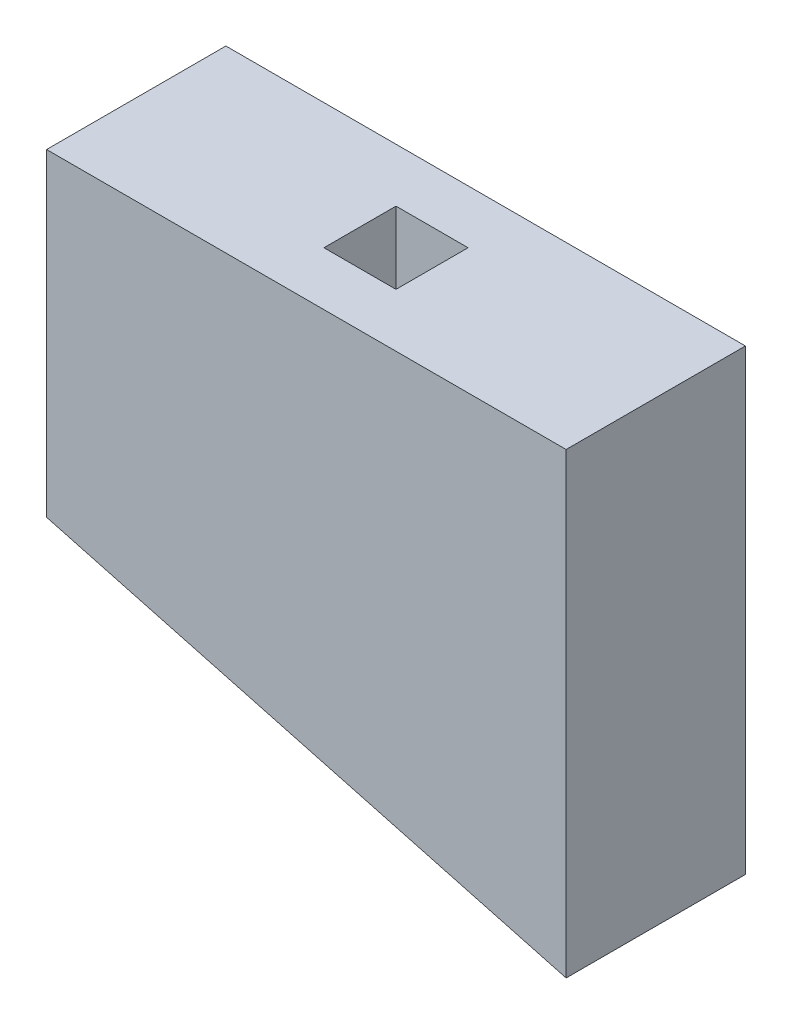
ISO-10303-21;
HEADER;
FILE_DESCRIPTION(('STEP AP214'),'2;1');
FILE_NAME('part.step','',(''),(''),'','','');
FILE_SCHEMA(('AUTOMOTIVE_DESIGN { 1 0 10303 214 1 1 1 1 }'));
ENDSEC;
DATA;
#1=APPLICATION_CONTEXT('core data for automotive mechanical design processes');
#2=APPLICATION_PROTOCOL_DEFINITION('international standard','automotive_design',2000,#1);
#3=PRODUCT_CONTEXT('',#1,'mechanical');
#4=PRODUCT('Part','Part','',(#3));
#5=PRODUCT_RELATED_PRODUCT_CATEGORY('part','',(#4));
#6=PRODUCT_DEFINITION_FORMATION('','',#4);
#7=PRODUCT_DEFINITION_CONTEXT('part definition',#1,'design');
#8=PRODUCT_DEFINITION('design','',#6,#7);
#9=PRODUCT_DEFINITION_SHAPE('','',#8);
#10=(LENGTH_UNIT() NAMED_UNIT(*) SI_UNIT(.MILLI.,.METRE.));
#11=(NAMED_UNIT(*) PLANE_ANGLE_UNIT() SI_UNIT($,.RADIAN.));
#12=(NAMED_UNIT(*) SI_UNIT($,.STERADIAN.) SOLID_ANGLE_UNIT());
#13=UNCERTAINTY_MEASURE_WITH_UNIT(LENGTH_MEASURE(1.E-05),#10,'distance_accuracy_value','');
#14=(GEOMETRIC_REPRESENTATION_CONTEXT(3) GLOBAL_UNCERTAINTY_ASSIGNED_CONTEXT((#13)) GLOBAL_UNIT_ASSIGNED_CONTEXT((#10,
#11,#12)) REPRESENTATION_CONTEXT('',''));
#15=CARTESIAN_POINT('',(0.,0.,0.));
#16=DIRECTION('',(0.,0.,1.));
#17=DIRECTION('',(1.,0.,0.));
#18=AXIS2_PLACEMENT_3D('',#15,#16,#17);
#19=CARTESIAN_POINT('',(0.,-18.2414554532318,0.));
#20=DIRECTION('',(0.,-1.,0.));
#21=DIRECTION('',(1.,0.,0.));
#22=AXIS2_PLACEMENT_3D('',#19,#20,#21);
#23=PLANE('',#22);
#24=DIRECTION('',(0.,0.,1.));
#25=VECTOR('',#24,1.);
#26=CARTESIAN_POINT('',(172.97208118959,-18.2414554532318,14.95));
#27=LINE('',#26,#25);
#28=CARTESIAN_POINT('',(172.97208118959,-18.2414554532318,14.95));
#29=VERTEX_POINT('',#28);
#30=CARTESIAN_POINT('',(172.97208118959,-18.2414554532318,35.05));
#31=VERTEX_POINT('',#30);
#32=EDGE_CURVE('E165',#29,#31,#27,.T.);
#33=ORIENTED_EDGE('',*,*,#32,.F.);
#34=DIRECTION('',(-1.,0.,0.));
#35=VECTOR('',#34,1.);
#36=CARTESIAN_POINT('',(193.07208118959,-18.2414554532318,14.95));
#37=LINE('',#36,#35);
#38=CARTESIAN_POINT('',(193.07208118959,-18.2414554532318,14.95));
#39=VERTEX_POINT('',#38);
#40=EDGE_CURVE('E55',#39,#29,#37,.T.);
#41=ORIENTED_EDGE('',*,*,#40,.F.);
#42=DIRECTION('',(0.,0.,-1.));
#43=VECTOR('',#42,1.);
#44=CARTESIAN_POINT('',(193.07208118959,-18.2414554532318,35.05));
#45=LINE('',#44,#43);
#46=CARTESIAN_POINT('',(193.07208118959,-18.2414554532318,35.05));
#47=VERTEX_POINT('',#46);
#48=EDGE_CURVE('E152',#47,#39,#45,.T.);
#49=ORIENTED_EDGE('',*,*,#48,.F.);
#50=DIRECTION('',(1.,0.,0.));
#51=VECTOR('',#50,1.);
#52=CARTESIAN_POINT('',(172.97208118959,-18.2414554532318,35.05));
#53=LINE('',#52,#51);
#54=EDGE_CURVE('E156',#31,#47,#53,.T.);
#55=ORIENTED_EDGE('',*,*,#54,.F.);
#56=EDGE_LOOP('',(#33,#41,#49,#55));
#57=FACE_BOUND('',#56,.T.);
#58=DIRECTION('',(0.,0.,-1.));
#59=VECTOR('',#58,1.);
#60=CARTESIAN_POINT('',(110.57764421791,-18.2414554532318,0.));
#61=LINE('',#60,#59);
#62=CARTESIAN_POINT('',(110.57764421791,-18.2414554532318,50.));
#63=VERTEX_POINT('',#62);
#64=CARTESIAN_POINT('',(110.57764421791,-18.2414554532318,0.));
#65=VERTEX_POINT('',#64);
#66=EDGE_CURVE('E243',#63,#65,#61,.T.);
#67=ORIENTED_EDGE('',*,*,#66,.F.);
#68=DIRECTION('',(1.,0.,0.));
#69=VECTOR('',#68,1.);
#70=CARTESIAN_POINT('',(45.6887702745492,-18.2414554532318,50.));
#71=LINE('',#70,#69);
#72=CARTESIAN_POINT('',(255.46651816127,-18.2414554532318,50.));
#73=VERTEX_POINT('',#72);
#74=EDGE_CURVE('E226',#63,#73,#71,.T.);
#75=ORIENTED_EDGE('',*,*,#74,.T.);
#76=DIRECTION('',(0.,0.,-1.));
#77=VECTOR('',#76,1.);
#78=CARTESIAN_POINT('',(255.46651816127,-18.2414554532318,50.));
#79=LINE('',#78,#77);
#80=CARTESIAN_POINT('',(255.46651816127,-18.2414554532318,0.));
#81=VERTEX_POINT('',#80);
#82=EDGE_CURVE('E222',#73,#81,#79,.T.);
#83=ORIENTED_EDGE('',*,*,#82,.T.);
#84=DIRECTION('',(1.,0.,0.));
#85=VECTOR('',#84,1.);
#86=CARTESIAN_POINT('',(-34.3112297254508,-18.2414554532318,0.));
#87=LINE('',#86,#85);
#88=EDGE_CURVE('E234',#65,#81,#87,.T.);
#89=ORIENTED_EDGE('',*,*,#88,.F.);
#90=EDGE_LOOP('',(#67,#75,#83,#89));
#91=FACE_BOUND('',#90,.T.);
#92=ADVANCED_FACE('F38',(#57,#91),#23,.F.);
#93=CARTESIAN_POINT('',(110.57764421791,0.,0.));
#94=DIRECTION('',(-1.,0.,0.));
#95=DIRECTION('',(0.,-1.,0.));
#96=AXIS2_PLACEMENT_3D('',#93,#94,#95);
#97=PLANE('',#96);
#98=DIRECTION('',(0.,0.,-1.));
#99=VECTOR('',#98,1.);
#100=CARTESIAN_POINT('',(110.57764421791,-52.6028838359208,35.05));
#101=LINE('',#100,#99);
#102=CARTESIAN_POINT('',(110.57764421791,-52.6028838359208,35.05));
#103=VERTEX_POINT('',#102);
#104=CARTESIAN_POINT('',(110.57764421791,-52.6028838359208,14.9500000000003));
#105=VERTEX_POINT('',#104);
#106=EDGE_CURVE('E63',#103,#105,#101,.T.);
#107=ORIENTED_EDGE('',*,*,#106,.F.);
#108=DIRECTION('',(0.,1.,0.));
#109=VECTOR('',#108,1.);
#110=CARTESIAN_POINT('',(110.57764421791,-72.7028838359199,35.05));
#111=LINE('',#110,#109);
#112=CARTESIAN_POINT('',(110.57764421791,-72.7028838359199,35.05));
#113=VERTEX_POINT('',#112);
#114=EDGE_CURVE('E184',#113,#103,#111,.T.);
#115=ORIENTED_EDGE('',*,*,#114,.F.);
#116=DIRECTION('',(0.,0.,1.));
#117=VECTOR('',#116,1.);
#118=CARTESIAN_POINT('',(110.57764421791,-72.7028838359205,14.95));
#119=LINE('',#118,#117);
#120=CARTESIAN_POINT('',(110.57764421791,-72.7028838359205,14.95));
#121=VERTEX_POINT('',#120);
#122=EDGE_CURVE('E203',#121,#113,#119,.T.);
#123=ORIENTED_EDGE('',*,*,#122,.F.);
#124=DIRECTION('',(0.,-1.,0.));
#125=VECTOR('',#124,1.);
#126=CARTESIAN_POINT('',(110.57764421791,-52.6028838359209,14.9500000000003));
#127=LINE('',#126,#125);
#128=EDGE_CURVE('E199',#105,#121,#127,.T.);
#129=ORIENTED_EDGE('',*,*,#128,.F.);
#130=EDGE_LOOP('',(#107,#115,#123,#129));
#131=FACE_BOUND('',#130,.T.);
#132=DIRECTION('',(0.,-1.,0.));
#133=VECTOR('',#132,1.);
#134=CARTESIAN_POINT('',(110.57764421791,31.6424845178765,50.));
#135=LINE('',#134,#133);
#136=CARTESIAN_POINT('',(110.57764421791,-107.064312218609,50.));
#137=VERTEX_POINT('',#136);
#138=EDGE_CURVE('E239',#63,#137,#135,.T.);
#139=ORIENTED_EDGE('',*,*,#138,.F.);
#140=ORIENTED_EDGE('',*,*,#66,.T.);
#141=DIRECTION('',(0.,-1.,0.));
#142=VECTOR('',#141,1.);
#143=CARTESIAN_POINT('',(110.57764421791,31.7585445467682,0.));
#144=LINE('',#143,#142);
#145=CARTESIAN_POINT('',(110.57764421791,-107.064312218609,0.));
#146=VERTEX_POINT('',#145);
#147=EDGE_CURVE('E213',#65,#146,#144,.T.);
#148=ORIENTED_EDGE('',*,*,#147,.T.);
#149=DIRECTION('',(0.,0.,-1.));
#150=VECTOR('',#149,1.);
#151=CARTESIAN_POINT('',(110.57764421791,-107.064312218609,50.));
#152=LINE('',#151,#150);
#153=EDGE_CURVE('E227',#137,#146,#152,.T.);
#154=ORIENTED_EDGE('',*,*,#153,.F.);
#155=EDGE_LOOP('',(#139,#140,#148,#154));
#156=FACE_BOUND('',#155,.T.);
#157=ADVANCED_FACE('F264',(#131,#156),#97,.T.);
#158=CARTESIAN_POINT('',(45.6887702745492,31.6424845178765,50.));
#159=DIRECTION('',(0.,0.,1.));
#160=DIRECTION('',(1.,0.,0.));
#161=AXIS2_PLACEMENT_3D('',#158,#159,#160);
#162=PLANE('',#161);
#163=ORIENTED_EDGE('',*,*,#74,.F.);
#164=ORIENTED_EDGE('',*,*,#138,.T.);
#165=DIRECTION('',(-0.96592582628907,0.258819045102514,0.));
#166=VECTOR('',#165,1.);
#167=CARTESIAN_POINT('',(-34.3112297254508,-68.2414554532319,50.));
#168=LINE('',#167,#166);
#169=CARTESIAN_POINT('',(255.46651816127,-145.887168983986,50.));
#170=VERTEX_POINT('',#169);
#171=EDGE_CURVE('E42',#170,#137,#168,.T.);
#172=ORIENTED_EDGE('',*,*,#171,.F.);
#173=DIRECTION('',(0.,-1.,0.));
#174=VECTOR('',#173,1.);
#175=CARTESIAN_POINT('',(255.46651816127,-145.887168983986,50.));
#176=LINE('',#175,#174);
#177=EDGE_CURVE('E228',#73,#170,#176,.T.);
#178=ORIENTED_EDGE('',*,*,#177,.F.);
#179=EDGE_LOOP('',(#163,#164,#172,#178));
#180=FACE_BOUND('',#179,.T.);
#181=ADVANCED_FACE('F271',(#180),#162,.T.);
#182=CARTESIAN_POINT('',(-34.3112297254508,-68.2414554532319,50.));
#183=DIRECTION('',(-0.258819045102514,-0.96592582628907,0.));
#184=DIRECTION('',(0.96592582628907,-0.258819045102514,0.));
#185=AXIS2_PLACEMENT_3D('',#182,#183,#184);
#186=PLANE('',#185);
#187=ORIENTED_EDGE('',*,*,#171,.T.);
#188=ORIENTED_EDGE('',*,*,#153,.T.);
#189=DIRECTION('',(-0.96592582628907,0.258819045102514,0.));
#190=VECTOR('',#189,1.);
#191=CARTESIAN_POINT('',(-34.3112297254508,-68.2414554532319,0.));
#192=LINE('',#191,#190);
#193=CARTESIAN_POINT('',(255.46651816127,-145.887168983986,0.));
#194=VERTEX_POINT('',#193);
#195=EDGE_CURVE('E231',#194,#146,#192,.T.);
#196=ORIENTED_EDGE('',*,*,#195,.F.);
#197=DIRECTION('',(0.,0.,-1.));
#198=VECTOR('',#197,1.);
#199=CARTESIAN_POINT('',(255.46651816127,-145.887168983986,50.));
#200=LINE('',#199,#198);
#201=EDGE_CURVE('E11',#170,#194,#200,.T.);
#202=ORIENTED_EDGE('',*,*,#201,.F.);
#203=EDGE_LOOP('',(#187,#188,#196,#202));
#204=FACE_BOUND('',#203,.T.);
#205=ADVANCED_FACE('F261',(#204),#186,.T.);
#206=CARTESIAN_POINT('',(-34.3112297254508,31.7585445467682,0.));
#207=DIRECTION('',(0.,0.,1.));
#208=DIRECTION('',(1.,0.,0.));
#209=AXIS2_PLACEMENT_3D('',#206,#207,#208);
#210=PLANE('',#209);
#211=ORIENTED_EDGE('',*,*,#147,.F.);
#212=ORIENTED_EDGE('',*,*,#88,.T.);
#213=DIRECTION('',(0.,-1.,0.));
#214=VECTOR('',#213,1.);
#215=CARTESIAN_POINT('',(255.46651816127,-145.887168983986,0.));
#216=LINE('',#215,#214);
#217=EDGE_CURVE('E232',#81,#194,#216,.T.);
#218=ORIENTED_EDGE('',*,*,#217,.T.);
#219=ORIENTED_EDGE('',*,*,#195,.T.);
#220=EDGE_LOOP('',(#211,#212,#218,#219));
#221=FACE_BOUND('',#220,.T.);
#222=ADVANCED_FACE('F40',(#221),#210,.F.);
#223=CARTESIAN_POINT('',(255.46651816127,-145.887168983986,50.));
#224=DIRECTION('',(1.,0.,0.));
#225=DIRECTION('',(0.,0.,-1.));
#226=AXIS2_PLACEMENT_3D('',#223,#224,#225);
#227=PLANE('',#226);
#228=ORIENTED_EDGE('',*,*,#82,.F.);
#229=ORIENTED_EDGE('',*,*,#177,.T.);
#230=ORIENTED_EDGE('',*,*,#201,.T.);
#231=ORIENTED_EDGE('',*,*,#217,.F.);
#232=EDGE_LOOP('',(#228,#229,#230,#231));
#233=FACE_BOUND('',#232,.T.);
#234=ADVANCED_FACE('F273',(#233),#227,.T.);
#235=CARTESIAN_POINT('',(130.57764421791,-52.6028838359208,35.05));
#236=DIRECTION('',(0.,1.,0.));
#237=DIRECTION('',(0.,0.,1.));
#238=AXIS2_PLACEMENT_3D('',#235,#236,#237);
#239=PLANE('',#238);
#240=ORIENTED_EDGE('',*,*,#106,.T.);
#241=DIRECTION('',(-1.,0.,0.));
#242=VECTOR('',#241,1.);
#243=CARTESIAN_POINT('',(130.57764421791,-52.6028838359208,14.9500000000003));
#244=LINE('',#243,#242);
#245=CARTESIAN_POINT('',(130.57764421791,-52.6028838359208,14.9500000000003));
#246=VERTEX_POINT('',#245);
#247=EDGE_CURVE('E196',#246,#105,#244,.T.);
#248=ORIENTED_EDGE('',*,*,#247,.F.);
#249=DIRECTION('',(0.,0.,-1.));
#250=VECTOR('',#249,1.);
#251=CARTESIAN_POINT('',(130.57764421791,-52.6028838359208,35.05));
#252=LINE('',#251,#250);
#253=CARTESIAN_POINT('',(130.57764421791,-52.6028838359208,35.05));
#254=VERTEX_POINT('',#253);
#255=EDGE_CURVE('E179',#254,#246,#252,.T.);
#256=ORIENTED_EDGE('',*,*,#255,.F.);
#257=DIRECTION('',(-1.,0.,0.));
#258=VECTOR('',#257,1.);
#259=CARTESIAN_POINT('',(130.57764421791,-52.6028838359208,35.05));
#260=LINE('',#259,#258);
#261=EDGE_CURVE('E210',#254,#103,#260,.T.);
#262=ORIENTED_EDGE('',*,*,#261,.T.);
#263=EDGE_LOOP('',(#240,#248,#256,#262));
#264=FACE_BOUND('',#263,.T.);
#265=ADVANCED_FACE('F275',(#264),#239,.F.);
#266=CARTESIAN_POINT('',(130.57764421791,-72.7028838359199,35.05));
#267=DIRECTION('',(0.,0.,1.));
#268=DIRECTION('',(1.,0.,0.));
#269=AXIS2_PLACEMENT_3D('',#266,#267,#268);
#270=PLANE('',#269);
#271=ORIENTED_EDGE('',*,*,#114,.T.);
#272=ORIENTED_EDGE('',*,*,#261,.F.);
#273=DIRECTION('',(0.,1.,0.));
#274=VECTOR('',#273,1.);
#275=CARTESIAN_POINT('',(130.57764421791,-72.7028838359199,35.05));
#276=LINE('',#275,#274);
#277=CARTESIAN_POINT('',(130.57764421791,-72.7028838359199,35.05));
#278=VERTEX_POINT('',#277);
#279=EDGE_CURVE('E192',#278,#254,#276,.T.);
#280=ORIENTED_EDGE('',*,*,#279,.F.);
#281=DIRECTION('',(-1.,0.,0.));
#282=VECTOR('',#281,1.);
#283=CARTESIAN_POINT('',(130.57764421791,-72.7028838359199,35.05));
#284=LINE('',#283,#282);
#285=EDGE_CURVE('E214',#278,#113,#284,.T.);
#286=ORIENTED_EDGE('',*,*,#285,.T.);
#287=EDGE_LOOP('',(#271,#272,#280,#286));
#288=FACE_BOUND('',#287,.T.);
#289=ADVANCED_FACE('F281',(#288),#270,.F.);
#290=CARTESIAN_POINT('',(130.57764421791,-72.7028838359205,14.95));
#291=DIRECTION('',(0.,-1.,0.));
#292=DIRECTION('',(0.,0.,-1.));
#293=AXIS2_PLACEMENT_3D('',#290,#291,#292);
#294=PLANE('',#293);
#295=ORIENTED_EDGE('',*,*,#122,.T.);
#296=ORIENTED_EDGE('',*,*,#285,.F.);
#297=DIRECTION('',(0.,0.,1.));
#298=VECTOR('',#297,1.);
#299=CARTESIAN_POINT('',(130.57764421791,-72.7028838359205,14.95));
#300=LINE('',#299,#298);
#301=CARTESIAN_POINT('',(130.57764421791,-72.7028838359205,14.95));
#302=VERTEX_POINT('',#301);
#303=EDGE_CURVE('E188',#302,#278,#300,.T.);
#304=ORIENTED_EDGE('',*,*,#303,.F.);
#305=DIRECTION('',(-1.,0.,0.));
#306=VECTOR('',#305,1.);
#307=CARTESIAN_POINT('',(130.57764421791,-72.7028838359205,14.95));
#308=LINE('',#307,#306);
#309=EDGE_CURVE('E217',#302,#121,#308,.T.);
#310=ORIENTED_EDGE('',*,*,#309,.T.);
#311=EDGE_LOOP('',(#295,#296,#304,#310));
#312=FACE_BOUND('',#311,.T.);
#313=ADVANCED_FACE('F332',(#312),#294,.F.);
#314=CARTESIAN_POINT('',(130.57764421791,-52.6028838359208,14.9500000000003));
#315=DIRECTION('',(0.,0.,-1.));
#316=DIRECTION('',(0.,1.,0.));
#317=AXIS2_PLACEMENT_3D('',#314,#315,#316);
#318=PLANE('',#317);
#319=ORIENTED_EDGE('',*,*,#128,.T.);
#320=ORIENTED_EDGE('',*,*,#309,.F.);
#321=DIRECTION('',(0.,-1.,0.));
#322=VECTOR('',#321,1.);
#323=CARTESIAN_POINT('',(130.57764421791,-52.6028838359208,14.9500000000003));
#324=LINE('',#323,#322);
#325=EDGE_CURVE('E183',#246,#302,#324,.T.);
#326=ORIENTED_EDGE('',*,*,#325,.F.);
#327=ORIENTED_EDGE('',*,*,#247,.T.);
#328=EDGE_LOOP('',(#319,#320,#326,#327));
#329=FACE_BOUND('',#328,.T.);
#330=ADVANCED_FACE('F342',(#329),#318,.F.);
#331=CARTESIAN_POINT('',(130.57764421791,0.,0.));
#332=DIRECTION('',(-1.,0.,0.));
#333=DIRECTION('',(0.,-1.,0.));
#334=AXIS2_PLACEMENT_3D('',#331,#332,#333);
#335=PLANE('',#334);
#336=ORIENTED_EDGE('',*,*,#255,.T.);
#337=ORIENTED_EDGE('',*,*,#325,.T.);
#338=ORIENTED_EDGE('',*,*,#303,.T.);
#339=ORIENTED_EDGE('',*,*,#279,.T.);
#340=EDGE_LOOP('',(#336,#337,#338,#339));
#341=FACE_BOUND('',#340,.T.);
#342=ADVANCED_FACE('F351',(#341),#335,.T.);
#343=CARTESIAN_POINT('',(193.07208118959,-38.2414554532318,14.95));
#344=DIRECTION('',(0.,0.,-1.));
#345=DIRECTION('',(-1.,0.,0.));
#346=AXIS2_PLACEMENT_3D('',#343,#344,#345);
#347=PLANE('',#346);
#348=ORIENTED_EDGE('',*,*,#40,.T.);
#349=DIRECTION('',(0.,1.,0.));
#350=VECTOR('',#349,1.);
#351=CARTESIAN_POINT('',(172.97208118959,-38.2414554532318,14.95));
#352=LINE('',#351,#350);
#353=CARTESIAN_POINT('',(172.97208118959,-38.2414554532318,14.95));
#354=VERTEX_POINT('',#353);
#355=EDGE_CURVE('E127',#354,#29,#352,.T.);
#356=ORIENTED_EDGE('',*,*,#355,.F.);
#357=DIRECTION('',(-1.,0.,0.));
#358=VECTOR('',#357,1.);
#359=CARTESIAN_POINT('',(193.07208118959,-38.2414554532318,14.95));
#360=LINE('',#359,#358);
#361=CARTESIAN_POINT('',(193.07208118959,-38.2414554532318,14.95));
#362=VERTEX_POINT('',#361);
#363=EDGE_CURVE('E131',#362,#354,#360,.T.);
#364=ORIENTED_EDGE('',*,*,#363,.F.);
#365=DIRECTION('',(0.,1.,0.));
#366=VECTOR('',#365,1.);
#367=CARTESIAN_POINT('',(193.07208118959,-38.2414554532318,14.95));
#368=LINE('',#367,#366);
#369=EDGE_CURVE('E171',#362,#39,#368,.T.);
#370=ORIENTED_EDGE('',*,*,#369,.T.);
#371=EDGE_LOOP('',(#348,#356,#364,#370));
#372=FACE_BOUND('',#371,.T.);
#373=ADVANCED_FACE('F129',(#372),#347,.F.);
#374=CARTESIAN_POINT('',(193.07208118959,-38.2414554532318,35.05));
#375=DIRECTION('',(1.,0.,0.));
#376=DIRECTION('',(0.,1.,0.));
#377=AXIS2_PLACEMENT_3D('',#374,#375,#376);
#378=PLANE('',#377);
#379=ORIENTED_EDGE('',*,*,#48,.T.);
#380=ORIENTED_EDGE('',*,*,#369,.F.);
#381=DIRECTION('',(0.,0.,-1.));
#382=VECTOR('',#381,1.);
#383=CARTESIAN_POINT('',(193.07208118959,-38.2414554532318,35.05));
#384=LINE('',#383,#382);
#385=CARTESIAN_POINT('',(193.07208118959,-38.2414554532318,35.05));
#386=VERTEX_POINT('',#385);
#387=EDGE_CURVE('E138',#386,#362,#384,.T.);
#388=ORIENTED_EDGE('',*,*,#387,.F.);
#389=DIRECTION('',(0.,1.,0.));
#390=VECTOR('',#389,1.);
#391=CARTESIAN_POINT('',(193.07208118959,-38.2414554532318,35.05));
#392=LINE('',#391,#390);
#393=EDGE_CURVE('E174',#386,#47,#392,.T.);
#394=ORIENTED_EDGE('',*,*,#393,.T.);
#395=EDGE_LOOP('',(#379,#380,#388,#394));
#396=FACE_BOUND('',#395,.T.);
#397=ADVANCED_FACE('F369',(#396),#378,.F.);
#398=CARTESIAN_POINT('',(172.97208118959,-38.2414554532318,35.05));
#399=DIRECTION('',(0.,0.,1.));
#400=DIRECTION('',(1.,0.,0.));
#401=AXIS2_PLACEMENT_3D('',#398,#399,#400);
#402=PLANE('',#401);
#403=ORIENTED_EDGE('',*,*,#54,.T.);
#404=ORIENTED_EDGE('',*,*,#393,.F.);
#405=DIRECTION('',(1.,0.,0.));
#406=VECTOR('',#405,1.);
#407=CARTESIAN_POINT('',(172.97208118959,-38.2414554532318,35.05));
#408=LINE('',#407,#406);
#409=CARTESIAN_POINT('',(172.97208118959,-38.2414554532318,35.05));
#410=VERTEX_POINT('',#409);
#411=EDGE_CURVE('E147',#410,#386,#408,.T.);
#412=ORIENTED_EDGE('',*,*,#411,.F.);
#413=DIRECTION('',(0.,1.,0.));
#414=VECTOR('',#413,1.);
#415=CARTESIAN_POINT('',(172.97208118959,-38.2414554532318,35.05));
#416=LINE('',#415,#414);
#417=EDGE_CURVE('E137',#410,#31,#416,.T.);
#418=ORIENTED_EDGE('',*,*,#417,.T.);
#419=EDGE_LOOP('',(#403,#404,#412,#418));
#420=FACE_BOUND('',#419,.T.);
#421=ADVANCED_FACE('F375',(#420),#402,.F.);
#422=CARTESIAN_POINT('',(172.97208118959,-38.2414554532318,14.95));
#423=DIRECTION('',(-1.,0.,0.));
#424=DIRECTION('',(0.,-1.,0.));
#425=AXIS2_PLACEMENT_3D('',#422,#423,#424);
#426=PLANE('',#425);
#427=ORIENTED_EDGE('',*,*,#32,.T.);
#428=ORIENTED_EDGE('',*,*,#417,.F.);
#429=DIRECTION('',(0.,0.,1.));
#430=VECTOR('',#429,1.);
#431=CARTESIAN_POINT('',(172.97208118959,-38.2414554532318,14.95));
#432=LINE('',#431,#430);
#433=EDGE_CURVE('E141',#354,#410,#432,.T.);
#434=ORIENTED_EDGE('',*,*,#433,.F.);
#435=ORIENTED_EDGE('',*,*,#355,.T.);
#436=EDGE_LOOP('',(#427,#428,#434,#435));
#437=FACE_BOUND('',#436,.T.);
#438=ADVANCED_FACE('F142',(#437),#426,.F.);
#439=CARTESIAN_POINT('',(0.,-38.2414554532318,0.));
#440=DIRECTION('',(0.,1.,0.));
#441=DIRECTION('',(-1.,0.,0.));
#442=AXIS2_PLACEMENT_3D('',#439,#440,#441);
#443=PLANE('',#442);
#444=ORIENTED_EDGE('',*,*,#363,.T.);
#445=ORIENTED_EDGE('',*,*,#433,.T.);
#446=ORIENTED_EDGE('',*,*,#411,.T.);
#447=ORIENTED_EDGE('',*,*,#387,.T.);
#448=EDGE_LOOP('',(#444,#445,#446,#447));
#449=FACE_BOUND('',#448,.T.);
#450=ADVANCED_FACE('F149',(#449),#443,.T.);
#451=CLOSED_SHELL('',(#92,#157,#181,#205,#222,#234,#265,#289,#313,#330,#342,#373,#397,#421,#438,#450));
#452=MANIFOLD_SOLID_BREP('B2',#451);
#453=ADVANCED_BREP_SHAPE_REPRESENTATION('',(#18,#452),#14);
#454=SHAPE_DEFINITION_REPRESENTATION(#9,#453);
ENDSEC;
END-ISO-10303-21;
